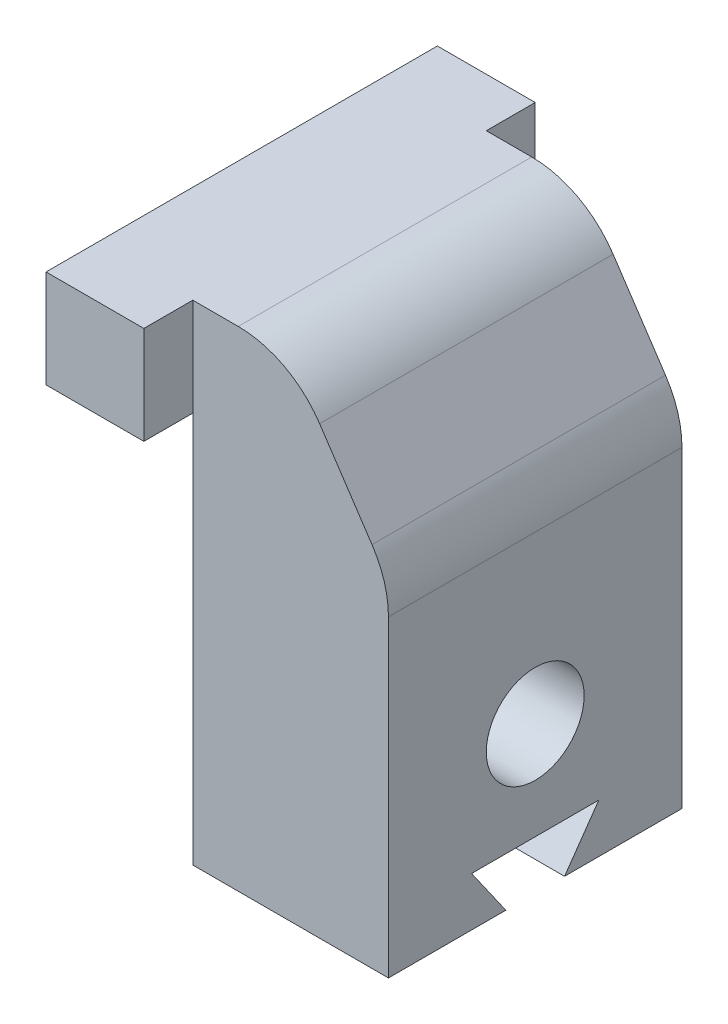
ISO-10303-21;
HEADER;
FILE_DESCRIPTION(('STEP AP214'),'2;1');
FILE_NAME('part.step','',(''),(''),'','','');
FILE_SCHEMA(('AUTOMOTIVE_DESIGN { 1 0 10303 214 1 1 1 1 }'));
ENDSEC;
DATA;
#1=APPLICATION_CONTEXT('core data for automotive mechanical design processes');
#2=APPLICATION_PROTOCOL_DEFINITION('international standard','automotive_design',2000,#1);
#3=PRODUCT_CONTEXT('',#1,'mechanical');
#4=PRODUCT('Part','Part','',(#3));
#5=PRODUCT_RELATED_PRODUCT_CATEGORY('part','',(#4));
#6=PRODUCT_DEFINITION_FORMATION('','',#4);
#7=PRODUCT_DEFINITION_CONTEXT('part definition',#1,'design');
#8=PRODUCT_DEFINITION('design','',#6,#7);
#9=PRODUCT_DEFINITION_SHAPE('','',#8);
#10=(LENGTH_UNIT() NAMED_UNIT(*) SI_UNIT(.MILLI.,.METRE.));
#11=(NAMED_UNIT(*) PLANE_ANGLE_UNIT() SI_UNIT($,.RADIAN.));
#12=(NAMED_UNIT(*) SI_UNIT($,.STERADIAN.) SOLID_ANGLE_UNIT());
#13=UNCERTAINTY_MEASURE_WITH_UNIT(LENGTH_MEASURE(1.E-05),#10,'distance_accuracy_value','');
#14=(GEOMETRIC_REPRESENTATION_CONTEXT(3) GLOBAL_UNCERTAINTY_ASSIGNED_CONTEXT((#13)) GLOBAL_UNIT_ASSIGNED_CONTEXT((#10,
#11,#12)) REPRESENTATION_CONTEXT('',''));
#15=CARTESIAN_POINT('',(0.,0.,0.));
#16=DIRECTION('',(0.,0.,1.));
#17=DIRECTION('',(1.,0.,0.));
#18=AXIS2_PLACEMENT_3D('',#15,#16,#17);
#19=CARTESIAN_POINT('',(0.,0.,30.));
#20=DIRECTION('',(0.,0.,1.));
#21=DIRECTION('',(1.,0.,0.));
#22=AXIS2_PLACEMENT_3D('',#19,#20,#21);
#23=PLANE('',#22);
#24=CARTESIAN_POINT('',(0.,6.97129736631865,30.));
#25=DIRECTION('',(0.,0.,-1.));
#26=DIRECTION('',(0.957066905218878,0.289867105644568,0.));
#27=AXIS2_PLACEMENT_3D('',#24,#25,#26);
#28=CIRCLE('',#27,10.);
#29=CARTESIAN_POINT('',(8.31954122130482,12.5197416407986,30.));
#30=VERTEX_POINT('',#29);
#31=CARTESIAN_POINT('',(10.,6.97129736631865,30.));
#32=VERTEX_POINT('',#31);
#33=EDGE_CURVE('E317',#30,#32,#28,.T.);
#34=ORIENTED_EDGE('',*,*,#33,.F.);
#35=DIRECTION('',(-0.554844427447999,0.831954122130482,0.));
#36=VECTOR('',#35,1.);
#37=CARTESIAN_POINT('',(10.,10.,30.));
#38=LINE('',#37,#36);
#39=CARTESIAN_POINT('',(2.96506217319632,20.54844427448,30.));
#40=VERTEX_POINT('',#39);
#41=EDGE_CURVE('E25',#30,#40,#38,.T.);
#42=ORIENTED_EDGE('',*,*,#41,.T.);
#43=CARTESIAN_POINT('',(-5.35447904810851,15.,30.));
#44=DIRECTION('',(0.,0.,1.));
#45=DIRECTION('',(0.831954122130482,0.554844427448,0.));
#46=AXIS2_PLACEMENT_3D('',#43,#44,#45);
#47=CIRCLE('',#46,10.);
#48=CARTESIAN_POINT('',(-5.35447904810851,25.,30.));
#49=VERTEX_POINT('',#48);
#50=EDGE_CURVE('E301',#40,#49,#47,.T.);
#51=ORIENTED_EDGE('',*,*,#50,.T.);
#52=DIRECTION('',(-1.,0.,0.));
#53=VECTOR('',#52,1.);
#54=CARTESIAN_POINT('',(-5.35447904810851,25.,30.));
#55=LINE('',#54,#53);
#56=CARTESIAN_POINT('',(-10.,25.,30.));
#57=VERTEX_POINT('',#56);
#58=EDGE_CURVE('E9',#49,#57,#55,.T.);
#59=ORIENTED_EDGE('',*,*,#58,.T.);
#60=DIRECTION('',(0.,-1.,0.));
#61=VECTOR('',#60,1.);
#62=CARTESIAN_POINT('',(-10.,25.,30.));
#63=LINE('',#62,#61);
#64=CARTESIAN_POINT('',(-10.,15.,30.));
#65=VERTEX_POINT('',#64);
#66=EDGE_CURVE('E196',#57,#65,#63,.T.);
#67=ORIENTED_EDGE('',*,*,#66,.T.);
#68=DIRECTION('',(0.,-1.,0.));
#69=VECTOR('',#68,1.);
#70=CARTESIAN_POINT('',(-10.,25.,30.));
#71=LINE('',#70,#69);
#72=CARTESIAN_POINT('',(-10.,-25.,30.));
#73=VERTEX_POINT('',#72);
#74=EDGE_CURVE('E205',#65,#73,#71,.T.);
#75=ORIENTED_EDGE('',*,*,#74,.T.);
#76=DIRECTION('',(1.,0.,0.));
#77=VECTOR('',#76,1.);
#78=CARTESIAN_POINT('',(-10.,-25.,30.));
#79=LINE('',#78,#77);
#80=CARTESIAN_POINT('',(10.,-25.,30.));
#81=VERTEX_POINT('',#80);
#82=EDGE_CURVE('E221',#73,#81,#79,.T.);
#83=ORIENTED_EDGE('',*,*,#82,.T.);
#84=DIRECTION('',(0.,1.,0.));
#85=VECTOR('',#84,1.);
#86=CARTESIAN_POINT('',(10.,-25.,30.));
#87=LINE('',#86,#85);
#88=EDGE_CURVE('E153',#81,#32,#87,.T.);
#89=ORIENTED_EDGE('',*,*,#88,.T.);
#90=EDGE_LOOP('',(#34,#42,#51,#59,#67,#75,#83,#89));
#91=FACE_BOUND('',#90,.T.);
#92=ADVANCED_FACE('F14',(#91),#23,.T.);
#93=CARTESIAN_POINT('',(-5.35447904810851,25.,0.));
#94=DIRECTION('',(0.,1.,0.));
#95=DIRECTION('',(-1.,0.,0.));
#96=AXIS2_PLACEMENT_3D('',#93,#94,#95);
#97=PLANE('',#96);
#98=DIRECTION('',(-1.,0.,0.));
#99=VECTOR('',#98,1.);
#100=CARTESIAN_POINT('',(-5.35447904810851,25.,0.));
#101=LINE('',#100,#99);
#102=CARTESIAN_POINT('',(-5.35447904810851,25.,0.));
#103=VERTEX_POINT('',#102);
#104=CARTESIAN_POINT('',(-10.,25.,0.));
#105=VERTEX_POINT('',#104);
#106=EDGE_CURVE('E174',#103,#105,#101,.T.);
#107=ORIENTED_EDGE('',*,*,#106,.T.);
#108=DIRECTION('',(0.,0.,-1.));
#109=VECTOR('',#108,1.);
#110=CARTESIAN_POINT('',(-10.,25.,35.));
#111=LINE('',#110,#109);
#112=CARTESIAN_POINT('',(-10.,25.,-5.));
#113=VERTEX_POINT('',#112);
#114=EDGE_CURVE('E141',#105,#113,#111,.T.);
#115=ORIENTED_EDGE('',*,*,#114,.T.);
#116=DIRECTION('',(-1.,0.,0.));
#117=VECTOR('',#116,1.);
#118=CARTESIAN_POINT('',(-10.,25.,-5.));
#119=LINE('',#118,#117);
#120=CARTESIAN_POINT('',(-20.,25.,-5.));
#121=VERTEX_POINT('',#120);
#122=EDGE_CURVE('E136',#113,#121,#119,.T.);
#123=ORIENTED_EDGE('',*,*,#122,.T.);
#124=DIRECTION('',(0.,0.,-1.));
#125=VECTOR('',#124,1.);
#126=CARTESIAN_POINT('',(-20.,25.,35.));
#127=LINE('',#126,#125);
#128=CARTESIAN_POINT('',(-20.,25.,35.));
#129=VERTEX_POINT('',#128);
#130=EDGE_CURVE('E294',#129,#121,#127,.T.);
#131=ORIENTED_EDGE('',*,*,#130,.F.);
#132=DIRECTION('',(-1.,0.,0.));
#133=VECTOR('',#132,1.);
#134=CARTESIAN_POINT('',(-10.,25.,35.));
#135=LINE('',#134,#133);
#136=CARTESIAN_POINT('',(-10.,25.,35.));
#137=VERTEX_POINT('',#136);
#138=EDGE_CURVE('E324',#137,#129,#135,.T.);
#139=ORIENTED_EDGE('',*,*,#138,.F.);
#140=DIRECTION('',(0.,0.,-1.));
#141=VECTOR('',#140,1.);
#142=CARTESIAN_POINT('',(-10.,25.,35.));
#143=LINE('',#142,#141);
#144=EDGE_CURVE('E334',#137,#57,#143,.T.);
#145=ORIENTED_EDGE('',*,*,#144,.T.);
#146=ORIENTED_EDGE('',*,*,#58,.F.);
#147=DIRECTION('',(0.,0.,1.));
#148=VECTOR('',#147,1.);
#149=CARTESIAN_POINT('',(-5.35447904810851,25.,0.));
#150=LINE('',#149,#148);
#151=EDGE_CURVE('E306',#103,#49,#150,.T.);
#152=ORIENTED_EDGE('',*,*,#151,.F.);
#153=EDGE_LOOP('',(#107,#115,#123,#131,#139,#145,#146,#152));
#154=FACE_BOUND('',#153,.T.);
#155=ADVANCED_FACE('F349',(#154),#97,.T.);
#156=CARTESIAN_POINT('',(-10.,-25.,0.));
#157=DIRECTION('',(0.,-1.,0.));
#158=DIRECTION('',(1.,0.,0.));
#159=AXIS2_PLACEMENT_3D('',#156,#157,#158);
#160=PLANE('',#159);
#161=DIRECTION('',(-1.,0.,0.));
#162=VECTOR('',#161,1.);
#163=CARTESIAN_POINT('',(-10.,-25.,12.));
#164=LINE('',#163,#162);
#165=CARTESIAN_POINT('',(10.,-25.,12.));
#166=VERTEX_POINT('',#165);
#167=CARTESIAN_POINT('',(-10.,-25.,12.));
#168=VERTEX_POINT('',#167);
#169=EDGE_CURVE('E210',#166,#168,#164,.T.);
#170=ORIENTED_EDGE('',*,*,#169,.T.);
#171=DIRECTION('',(0.,0.,1.));
#172=VECTOR('',#171,1.);
#173=CARTESIAN_POINT('',(-10.,-25.,0.));
#174=LINE('',#173,#172);
#175=CARTESIAN_POINT('',(-10.,-25.,0.));
#176=VERTEX_POINT('',#175);
#177=EDGE_CURVE('E168',#176,#168,#174,.T.);
#178=ORIENTED_EDGE('',*,*,#177,.F.);
#179=DIRECTION('',(1.,0.,0.));
#180=VECTOR('',#179,1.);
#181=CARTESIAN_POINT('',(-10.,-25.,0.));
#182=LINE('',#181,#180);
#183=CARTESIAN_POINT('',(10.,-25.,0.));
#184=VERTEX_POINT('',#183);
#185=EDGE_CURVE('E161',#176,#184,#182,.T.);
#186=ORIENTED_EDGE('',*,*,#185,.T.);
#187=DIRECTION('',(0.,0.,1.));
#188=VECTOR('',#187,1.);
#189=CARTESIAN_POINT('',(10.,-25.,0.));
#190=LINE('',#189,#188);
#191=EDGE_CURVE('E202',#184,#166,#190,.T.);
#192=ORIENTED_EDGE('',*,*,#191,.T.);
#193=EDGE_LOOP('',(#170,#178,#186,#192));
#194=FACE_BOUND('',#193,.T.);
#195=ADVANCED_FACE('F353',(#194),#160,.T.);
#196=CARTESIAN_POINT('',(10.,10.,0.));
#197=DIRECTION('',(0.831954122130483,0.554844427448,0.));
#198=DIRECTION('',(-0.554844427448,0.831954122130483,0.));
#199=AXIS2_PLACEMENT_3D('',#196,#197,#198);
#200=PLANE('',#199);
#201=DIRECTION('',(0.,0.,1.));
#202=VECTOR('',#201,1.);
#203=CARTESIAN_POINT('',(8.31954122130483,12.5197416407986,0.));
#204=LINE('',#203,#202);
#205=CARTESIAN_POINT('',(8.31954122130482,12.5197416407986,0.));
#206=VERTEX_POINT('',#205);
#207=EDGE_CURVE('E159',#206,#30,#204,.T.);
#208=ORIENTED_EDGE('',*,*,#207,.F.);
#209=DIRECTION('',(-0.554844427447999,0.831954122130482,0.));
#210=VECTOR('',#209,1.);
#211=CARTESIAN_POINT('',(10.,10.,0.));
#212=LINE('',#211,#210);
#213=CARTESIAN_POINT('',(2.96506217319632,20.54844427448,0.));
#214=VERTEX_POINT('',#213);
#215=EDGE_CURVE('E184',#206,#214,#212,.T.);
#216=ORIENTED_EDGE('',*,*,#215,.T.);
#217=DIRECTION('',(0.,0.,1.));
#218=VECTOR('',#217,1.);
#219=CARTESIAN_POINT('',(2.96506217319632,20.54844427448,0.));
#220=LINE('',#219,#218);
#221=EDGE_CURVE('E207',#214,#40,#220,.T.);
#222=ORIENTED_EDGE('',*,*,#221,.T.);
#223=ORIENTED_EDGE('',*,*,#41,.F.);
#224=EDGE_LOOP('',(#208,#216,#222,#223));
#225=FACE_BOUND('',#224,.T.);
#226=ADVANCED_FACE('F360',(#225),#200,.T.);
#227=CARTESIAN_POINT('',(-5.35447904810851,15.,0.));
#228=DIRECTION('',(0.,0.,-1.));
#229=DIRECTION('',(0.831954122130482,0.554844427448,0.));
#230=AXIS2_PLACEMENT_3D('',#227,#228,#229);
#231=CYLINDRICAL_SURFACE('',#230,10.);
#232=CARTESIAN_POINT('',(-5.35447904810851,15.,0.));
#233=DIRECTION('',(0.,0.,1.));
#234=DIRECTION('',(0.831954122130482,0.554844427448,0.));
#235=AXIS2_PLACEMENT_3D('',#232,#233,#234);
#236=CIRCLE('',#235,10.);
#237=EDGE_CURVE('E176',#214,#103,#236,.T.);
#238=ORIENTED_EDGE('',*,*,#237,.T.);
#239=ORIENTED_EDGE('',*,*,#151,.T.);
#240=ORIENTED_EDGE('',*,*,#50,.F.);
#241=ORIENTED_EDGE('',*,*,#221,.F.);
#242=EDGE_LOOP('',(#238,#239,#240,#241));
#243=FACE_BOUND('',#242,.T.);
#244=ADVANCED_FACE('F363',(#243),#231,.T.);
#245=CARTESIAN_POINT('',(0.,0.,0.));
#246=DIRECTION('',(0.,0.,1.));
#247=DIRECTION('',(1.,0.,0.));
#248=AXIS2_PLACEMENT_3D('',#245,#246,#247);
#249=PLANE('',#248);
#250=CARTESIAN_POINT('',(0.,6.97129736631865,0.));
#251=DIRECTION('',(0.,0.,1.));
#252=DIRECTION('',(0.957066905218878,0.289867105644568,0.));
#253=AXIS2_PLACEMENT_3D('',#250,#251,#252);
#254=CIRCLE('',#253,10.);
#255=CARTESIAN_POINT('',(10.,6.97129736631865,0.));
#256=VERTEX_POINT('',#255);
#257=EDGE_CURVE('E162',#256,#206,#254,.T.);
#258=ORIENTED_EDGE('',*,*,#257,.F.);
#259=DIRECTION('',(0.,1.,0.));
#260=VECTOR('',#259,1.);
#261=CARTESIAN_POINT('',(10.,-25.,0.));
#262=LINE('',#261,#260);
#263=EDGE_CURVE('E198',#184,#256,#262,.T.);
#264=ORIENTED_EDGE('',*,*,#263,.F.);
#265=ORIENTED_EDGE('',*,*,#185,.F.);
#266=DIRECTION('',(0.,-1.,0.));
#267=VECTOR('',#266,1.);
#268=CARTESIAN_POINT('',(-10.,25.,0.));
#269=LINE('',#268,#267);
#270=CARTESIAN_POINT('',(-10.,15.,0.));
#271=VERTEX_POINT('',#270);
#272=EDGE_CURVE('E164',#271,#176,#269,.T.);
#273=ORIENTED_EDGE('',*,*,#272,.F.);
#274=DIRECTION('',(0.,-1.,0.));
#275=VECTOR('',#274,1.);
#276=CARTESIAN_POINT('',(-10.,25.,0.));
#277=LINE('',#276,#275);
#278=EDGE_CURVE('E145',#105,#271,#277,.T.);
#279=ORIENTED_EDGE('',*,*,#278,.F.);
#280=ORIENTED_EDGE('',*,*,#106,.F.);
#281=ORIENTED_EDGE('',*,*,#237,.F.);
#282=ORIENTED_EDGE('',*,*,#215,.F.);
#283=EDGE_LOOP('',(#258,#264,#265,#273,#279,#280,#281,#282));
#284=FACE_BOUND('',#283,.T.);
#285=ADVANCED_FACE('F351',(#284),#249,.F.);
#286=CARTESIAN_POINT('',(0.,6.97129736631865,0.));
#287=DIRECTION('',(0.,0.,-1.));
#288=DIRECTION('',(0.957066905218878,0.289867105644568,0.));
#289=AXIS2_PLACEMENT_3D('',#286,#287,#288);
#290=CYLINDRICAL_SURFACE('',#289,10.);
#291=ORIENTED_EDGE('',*,*,#33,.T.);
#292=DIRECTION('',(0.,0.,-1.));
#293=VECTOR('',#292,1.);
#294=CARTESIAN_POINT('',(10.,6.97129736631865,0.));
#295=LINE('',#294,#293);
#296=EDGE_CURVE('E201',#32,#256,#295,.T.);
#297=ORIENTED_EDGE('',*,*,#296,.T.);
#298=ORIENTED_EDGE('',*,*,#257,.T.);
#299=ORIENTED_EDGE('',*,*,#207,.T.);
#300=EDGE_LOOP('',(#291,#297,#298,#299));
#301=FACE_BOUND('',#300,.T.);
#302=ADVANCED_FACE('F358',(#301),#290,.T.);
#303=CARTESIAN_POINT('',(-20.,20.,15.));
#304=DIRECTION('',(-1.,0.,0.));
#305=DIRECTION('',(0.,0.,1.));
#306=AXIS2_PLACEMENT_3D('',#303,#304,#305);
#307=PLANE('',#306);
#308=ORIENTED_EDGE('',*,*,#130,.T.);
#309=DIRECTION('',(0.,-1.,0.));
#310=VECTOR('',#309,1.);
#311=CARTESIAN_POINT('',(-20.,25.,-5.));
#312=LINE('',#311,#310);
#313=CARTESIAN_POINT('',(-20.,15.,-5.));
#314=VERTEX_POINT('',#313);
#315=EDGE_CURVE('E130',#121,#314,#312,.T.);
#316=ORIENTED_EDGE('',*,*,#315,.T.);
#317=DIRECTION('',(0.,0.,1.));
#318=VECTOR('',#317,1.);
#319=CARTESIAN_POINT('',(-20.,15.,-5.));
#320=LINE('',#319,#318);
#321=CARTESIAN_POINT('',(-20.,15.,35.));
#322=VERTEX_POINT('',#321);
#323=EDGE_CURVE('E126',#314,#322,#320,.T.);
#324=ORIENTED_EDGE('',*,*,#323,.T.);
#325=DIRECTION('',(0.,1.,0.));
#326=VECTOR('',#325,1.);
#327=CARTESIAN_POINT('',(-20.,15.,35.));
#328=LINE('',#327,#326);
#329=EDGE_CURVE('E298',#322,#129,#328,.T.);
#330=ORIENTED_EDGE('',*,*,#329,.T.);
#331=EDGE_LOOP('',(#308,#316,#324,#330));
#332=FACE_BOUND('',#331,.T.);
#333=ADVANCED_FACE('F344',(#332),#307,.T.);
#334=CARTESIAN_POINT('',(-10.,25.,-5.));
#335=DIRECTION('',(0.,0.,-1.));
#336=DIRECTION('',(0.,-1.,0.));
#337=AXIS2_PLACEMENT_3D('',#334,#335,#336);
#338=PLANE('',#337);
#339=DIRECTION('',(0.,-1.,0.));
#340=VECTOR('',#339,1.);
#341=CARTESIAN_POINT('',(-10.,25.,-5.));
#342=LINE('',#341,#340);
#343=CARTESIAN_POINT('',(-10.,15.,-5.));
#344=VERTEX_POINT('',#343);
#345=EDGE_CURVE('E133',#113,#344,#342,.T.);
#346=ORIENTED_EDGE('',*,*,#345,.T.);
#347=DIRECTION('',(-1.,0.,0.));
#348=VECTOR('',#347,1.);
#349=CARTESIAN_POINT('',(-10.,15.,-5.));
#350=LINE('',#349,#348);
#351=EDGE_CURVE('E118',#344,#314,#350,.T.);
#352=ORIENTED_EDGE('',*,*,#351,.T.);
#353=ORIENTED_EDGE('',*,*,#315,.F.);
#354=ORIENTED_EDGE('',*,*,#122,.F.);
#355=EDGE_LOOP('',(#346,#352,#353,#354));
#356=FACE_BOUND('',#355,.T.);
#357=ADVANCED_FACE('F134',(#356),#338,.T.);
#358=CARTESIAN_POINT('',(-10.,15.,-5.));
#359=DIRECTION('',(0.,-1.,0.));
#360=DIRECTION('',(0.,0.,1.));
#361=AXIS2_PLACEMENT_3D('',#358,#359,#360);
#362=PLANE('',#361);
#363=DIRECTION('',(0.,0.,1.));
#364=VECTOR('',#363,1.);
#365=CARTESIAN_POINT('',(-10.,15.,-5.));
#366=LINE('',#365,#364);
#367=EDGE_CURVE('E123',#344,#271,#366,.T.);
#368=ORIENTED_EDGE('',*,*,#367,.T.);
#369=DIRECTION('',(0.,0.,-1.));
#370=VECTOR('',#369,1.);
#371=CARTESIAN_POINT('',(-10.,15.,-2.5));
#372=LINE('',#371,#370);
#373=EDGE_CURVE('E169',#65,#271,#372,.T.);
#374=ORIENTED_EDGE('',*,*,#373,.F.);
#375=DIRECTION('',(0.,0.,1.));
#376=VECTOR('',#375,1.);
#377=CARTESIAN_POINT('',(-10.,15.,-5.));
#378=LINE('',#377,#376);
#379=CARTESIAN_POINT('',(-10.,15.,35.));
#380=VERTEX_POINT('',#379);
#381=EDGE_CURVE('E18',#65,#380,#378,.T.);
#382=ORIENTED_EDGE('',*,*,#381,.T.);
#383=DIRECTION('',(-1.,0.,0.));
#384=VECTOR('',#383,1.);
#385=CARTESIAN_POINT('',(-10.,15.,35.));
#386=LINE('',#385,#384);
#387=EDGE_CURVE('E295',#380,#322,#386,.T.);
#388=ORIENTED_EDGE('',*,*,#387,.T.);
#389=ORIENTED_EDGE('',*,*,#323,.F.);
#390=ORIENTED_EDGE('',*,*,#351,.F.);
#391=EDGE_LOOP('',(#368,#374,#382,#388,#389,#390));
#392=FACE_BOUND('',#391,.T.);
#393=ADVANCED_FACE('F120',(#392),#362,.T.);
#394=CARTESIAN_POINT('',(-10.,15.,35.));
#395=DIRECTION('',(0.,0.,1.));
#396=DIRECTION('',(0.,1.,0.));
#397=AXIS2_PLACEMENT_3D('',#394,#395,#396);
#398=PLANE('',#397);
#399=DIRECTION('',(0.,1.,0.));
#400=VECTOR('',#399,1.);
#401=CARTESIAN_POINT('',(-10.,15.,35.));
#402=LINE('',#401,#400);
#403=EDGE_CURVE('E157',#380,#137,#402,.T.);
#404=ORIENTED_EDGE('',*,*,#403,.T.);
#405=ORIENTED_EDGE('',*,*,#138,.T.);
#406=ORIENTED_EDGE('',*,*,#329,.F.);
#407=ORIENTED_EDGE('',*,*,#387,.F.);
#408=EDGE_LOOP('',(#404,#405,#406,#407));
#409=FACE_BOUND('',#408,.T.);
#410=ADVANCED_FACE('F347',(#409),#398,.T.);
#411=CARTESIAN_POINT('',(-10.,20.,15.));
#412=DIRECTION('',(-1.,0.,0.));
#413=DIRECTION('',(0.,0.,1.));
#414=AXIS2_PLACEMENT_3D('',#411,#412,#413);
#415=PLANE('',#414);
#416=ORIENTED_EDGE('',*,*,#66,.F.);
#417=ORIENTED_EDGE('',*,*,#144,.F.);
#418=ORIENTED_EDGE('',*,*,#403,.F.);
#419=ORIENTED_EDGE('',*,*,#381,.F.);
#420=EDGE_LOOP('',(#416,#417,#418,#419));
#421=FACE_BOUND('',#420,.T.);
#422=ADVANCED_FACE('F16',(#421),#415,.F.);
#423=CARTESIAN_POINT('',(-10.,20.,15.));
#424=DIRECTION('',(-1.,0.,0.));
#425=DIRECTION('',(0.,0.,1.));
#426=AXIS2_PLACEMENT_3D('',#423,#424,#425);
#427=PLANE('',#426);
#428=ORIENTED_EDGE('',*,*,#278,.T.);
#429=ORIENTED_EDGE('',*,*,#367,.F.);
#430=ORIENTED_EDGE('',*,*,#345,.F.);
#431=ORIENTED_EDGE('',*,*,#114,.F.);
#432=EDGE_LOOP('',(#428,#429,#430,#431));
#433=FACE_BOUND('',#432,.T.);
#434=ADVANCED_FACE('F143',(#433),#427,.F.);
#435=CARTESIAN_POINT('',(10.,-25.,0.));
#436=DIRECTION('',(1.,0.,0.));
#437=DIRECTION('',(0.,1.,0.));
#438=AXIS2_PLACEMENT_3D('',#435,#436,#437);
#439=PLANE('',#438);
#440=DIRECTION('',(0.,0.819231920519041,0.573462344363328));
#441=VECTOR('',#440,1.);
#442=CARTESIAN_POINT('',(10.,-26.7281879194631,16.7902684563759));
#443=LINE('',#442,#441);
#444=CARTESIAN_POINT('',(10.,-25.,18.));
#445=VERTEX_POINT('',#444);
#446=CARTESIAN_POINT('',(10.,-20.,21.5));
#447=VERTEX_POINT('',#446);
#448=EDGE_CURVE('E173',#445,#447,#443,.T.);
#449=ORIENTED_EDGE('',*,*,#448,.T.);
#450=DIRECTION('',(0.,0.,-1.));
#451=VECTOR('',#450,1.);
#452=CARTESIAN_POINT('',(10.,-20.,4.25));
#453=LINE('',#452,#451);
#454=CARTESIAN_POINT('',(10.,-20.,8.5));
#455=VERTEX_POINT('',#454);
#456=EDGE_CURVE('E277',#447,#455,#453,.T.);
#457=ORIENTED_EDGE('',*,*,#456,.T.);
#458=DIRECTION('',(0.,-0.819231920519041,0.573462344363328));
#459=VECTOR('',#458,1.);
#460=CARTESIAN_POINT('',(10.,-22.1812080536913,10.0268456375839));
#461=LINE('',#460,#459);
#462=EDGE_CURVE('E263',#455,#166,#461,.T.);
#463=ORIENTED_EDGE('',*,*,#462,.T.);
#464=ORIENTED_EDGE('',*,*,#191,.F.);
#465=ORIENTED_EDGE('',*,*,#263,.T.);
#466=ORIENTED_EDGE('',*,*,#296,.F.);
#467=ORIENTED_EDGE('',*,*,#88,.F.);
#468=DIRECTION('',(0.,0.,1.));
#469=VECTOR('',#468,1.);
#470=CARTESIAN_POINT('',(10.,-25.,0.));
#471=LINE('',#470,#469);
#472=EDGE_CURVE('E224',#445,#81,#471,.T.);
#473=ORIENTED_EDGE('',*,*,#472,.F.);
#474=EDGE_LOOP('',(#449,#457,#463,#464,#465,#466,#467,#473));
#475=FACE_BOUND('',#474,.T.);
#476=CARTESIAN_POINT('',(10.,-10.,15.));
#477=DIRECTION('',(-1.,0.,0.));
#478=DIRECTION('',(0.,0.,1.));
#479=AXIS2_PLACEMENT_3D('',#476,#477,#478);
#480=CIRCLE('',#479,5.);
#481=CARTESIAN_POINT('',(10.,-10.,10.));
#482=VERTEX_POINT('',#481);
#483=EDGE_CURVE('E211',#482,#482,#480,.T.);
#484=ORIENTED_EDGE('',*,*,#483,.T.);
#485=EDGE_LOOP('',(#484));
#486=FACE_BOUND('',#485,.T.);
#487=ADVANCED_FACE('F280',(#475,#486),#439,.T.);
#488=CARTESIAN_POINT('',(-10.,-25.,0.));
#489=DIRECTION('',(0.,-1.,0.));
#490=DIRECTION('',(1.,0.,0.));
#491=AXIS2_PLACEMENT_3D('',#488,#489,#490);
#492=PLANE('',#491);
#493=DIRECTION('',(1.,0.,0.));
#494=VECTOR('',#493,1.);
#495=CARTESIAN_POINT('',(-10.,-25.,18.));
#496=LINE('',#495,#494);
#497=CARTESIAN_POINT('',(-10.,-25.,18.));
#498=VERTEX_POINT('',#497);
#499=EDGE_CURVE('E170',#498,#445,#496,.T.);
#500=ORIENTED_EDGE('',*,*,#499,.T.);
#501=ORIENTED_EDGE('',*,*,#472,.T.);
#502=ORIENTED_EDGE('',*,*,#82,.F.);
#503=DIRECTION('',(0.,0.,1.));
#504=VECTOR('',#503,1.);
#505=CARTESIAN_POINT('',(-10.,-25.,0.));
#506=LINE('',#505,#504);
#507=EDGE_CURVE('E214',#498,#73,#506,.T.);
#508=ORIENTED_EDGE('',*,*,#507,.F.);
#509=EDGE_LOOP('',(#500,#501,#502,#508));
#510=FACE_BOUND('',#509,.T.);
#511=ADVANCED_FACE('F243',(#510),#492,.T.);
#512=CARTESIAN_POINT('',(-10.,25.,0.));
#513=DIRECTION('',(-1.,0.,0.));
#514=DIRECTION('',(0.,-1.,0.));
#515=AXIS2_PLACEMENT_3D('',#512,#513,#514);
#516=PLANE('',#515);
#517=DIRECTION('',(0.,0.819231920519041,-0.573462344363328));
#518=VECTOR('',#517,1.);
#519=CARTESIAN_POINT('',(-10.,-5.40268456375839,-1.71812080536913));
#520=LINE('',#519,#518);
#521=CARTESIAN_POINT('',(-10.,-20.,8.5));
#522=VERTEX_POINT('',#521);
#523=EDGE_CURVE('E272',#168,#522,#520,.T.);
#524=ORIENTED_EDGE('',*,*,#523,.T.);
#525=DIRECTION('',(0.,0.,1.));
#526=VECTOR('',#525,1.);
#527=CARTESIAN_POINT('',(-10.,-20.,4.25));
#528=LINE('',#527,#526);
#529=CARTESIAN_POINT('',(-10.,-20.,21.5));
#530=VERTEX_POINT('',#529);
#531=EDGE_CURVE('E234',#522,#530,#528,.T.);
#532=ORIENTED_EDGE('',*,*,#531,.T.);
#533=DIRECTION('',(0.,-0.819231920519041,-0.573462344363328));
#534=VECTOR('',#533,1.);
#535=CARTESIAN_POINT('',(-10.,-9.94966442953021,28.5352348993289));
#536=LINE('',#535,#534);
#537=EDGE_CURVE('E172',#530,#498,#536,.T.);
#538=ORIENTED_EDGE('',*,*,#537,.T.);
#539=ORIENTED_EDGE('',*,*,#507,.T.);
#540=ORIENTED_EDGE('',*,*,#74,.F.);
#541=ORIENTED_EDGE('',*,*,#373,.T.);
#542=ORIENTED_EDGE('',*,*,#272,.T.);
#543=ORIENTED_EDGE('',*,*,#177,.T.);
#544=EDGE_LOOP('',(#524,#532,#538,#539,#540,#541,#542,#543));
#545=FACE_BOUND('',#544,.T.);
#546=CARTESIAN_POINT('',(-10.,-10.,15.));
#547=DIRECTION('',(1.,0.,0.));
#548=DIRECTION('',(0.,0.,1.));
#549=AXIS2_PLACEMENT_3D('',#546,#547,#548);
#550=CIRCLE('',#549,5.);
#551=CARTESIAN_POINT('',(-10.,-10.,20.));
#552=VERTEX_POINT('',#551);
#553=EDGE_CURVE('E213',#552,#552,#550,.T.);
#554=ORIENTED_EDGE('',*,*,#553,.T.);
#555=EDGE_LOOP('',(#554));
#556=FACE_BOUND('',#555,.T.);
#557=ADVANCED_FACE('F229',(#545,#556),#516,.T.);
#558=CARTESIAN_POINT('',(-10.,-20.,21.5));
#559=DIRECTION('',(0.,-0.573462344363328,0.819231920519041));
#560=DIRECTION('',(0.,-0.819231920519041,-0.573462344363328));
#561=AXIS2_PLACEMENT_3D('',#558,#559,#560);
#562=PLANE('',#561);
#563=ORIENTED_EDGE('',*,*,#448,.F.);
#564=ORIENTED_EDGE('',*,*,#499,.F.);
#565=ORIENTED_EDGE('',*,*,#537,.F.);
#566=DIRECTION('',(1.,0.,0.));
#567=VECTOR('',#566,1.);
#568=CARTESIAN_POINT('',(-10.,-20.,21.5));
#569=LINE('',#568,#567);
#570=EDGE_CURVE('E282',#530,#447,#569,.T.);
#571=ORIENTED_EDGE('',*,*,#570,.T.);
#572=EDGE_LOOP('',(#563,#564,#565,#571));
#573=FACE_BOUND('',#572,.T.);
#574=ADVANCED_FACE('F240',(#573),#562,.F.);
#575=CARTESIAN_POINT('',(-10.,-25.,12.));
#576=DIRECTION('',(0.,-0.573462344363328,-0.819231920519041));
#577=DIRECTION('',(0.,0.819231920519041,-0.573462344363328));
#578=AXIS2_PLACEMENT_3D('',#575,#576,#577);
#579=PLANE('',#578);
#580=ORIENTED_EDGE('',*,*,#462,.F.);
#581=DIRECTION('',(1.,0.,0.));
#582=VECTOR('',#581,1.);
#583=CARTESIAN_POINT('',(-10.,-20.,8.5));
#584=LINE('',#583,#582);
#585=EDGE_CURVE('E267',#522,#455,#584,.T.);
#586=ORIENTED_EDGE('',*,*,#585,.F.);
#587=ORIENTED_EDGE('',*,*,#523,.F.);
#588=ORIENTED_EDGE('',*,*,#169,.F.);
#589=EDGE_LOOP('',(#580,#586,#587,#588));
#590=FACE_BOUND('',#589,.T.);
#591=ADVANCED_FACE('F265',(#590),#579,.F.);
#592=CARTESIAN_POINT('',(-10.,-20.,8.5));
#593=DIRECTION('',(0.,1.,0.));
#594=DIRECTION('',(0.,0.,1.));
#595=AXIS2_PLACEMENT_3D('',#592,#593,#594);
#596=PLANE('',#595);
#597=ORIENTED_EDGE('',*,*,#456,.F.);
#598=ORIENTED_EDGE('',*,*,#570,.F.);
#599=ORIENTED_EDGE('',*,*,#531,.F.);
#600=ORIENTED_EDGE('',*,*,#585,.T.);
#601=EDGE_LOOP('',(#597,#598,#599,#600));
#602=FACE_BOUND('',#601,.T.);
#603=ADVANCED_FACE('F276',(#602),#596,.F.);
#604=CARTESIAN_POINT('',(5.,-10.,15.));
#605=DIRECTION('',(1.,0.,0.));
#606=DIRECTION('',(0.,0.,1.));
#607=AXIS2_PLACEMENT_3D('',#604,#605,#606);
#608=CYLINDRICAL_SURFACE('',#607,5.);
#609=ORIENTED_EDGE('',*,*,#553,.F.);
#610=EDGE_LOOP('',(#609));
#611=FACE_BOUND('',#610,.T.);
#612=ORIENTED_EDGE('',*,*,#483,.F.);
#613=EDGE_LOOP('',(#612));
#614=FACE_BOUND('',#613,.T.);
#615=ADVANCED_FACE('F385',(#611,#614),#608,.F.);
#616=CLOSED_SHELL('',(#92,#155,#195,#226,#244,#285,#302,#333,#357,#393,#410,#422,#434,#487,#511,
#557,#574,#591,#603,#615));
#617=MANIFOLD_SOLID_BREP('B1',#616);
#618=ADVANCED_BREP_SHAPE_REPRESENTATION('',(#18,#617),#14);
#619=SHAPE_DEFINITION_REPRESENTATION(#9,#618);
ENDSEC;
END-ISO-10303-21;
